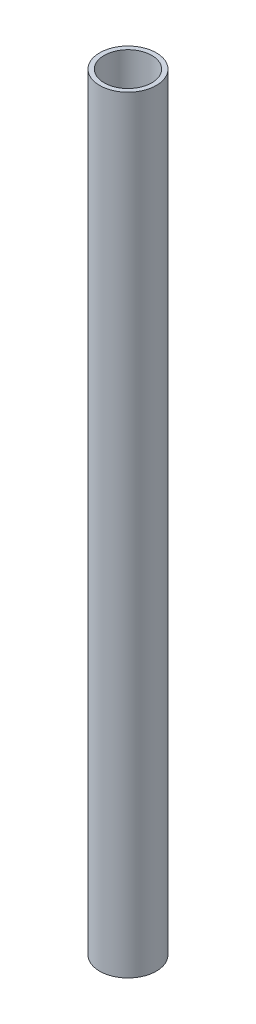
ISO-10303-21;
HEADER;
FILE_DESCRIPTION(('STEP AP214'),'2;1');
FILE_NAME('part.step','',(''),(''),'','','');
FILE_SCHEMA(('AUTOMOTIVE_DESIGN { 1 0 10303 214 1 1 1 1 }'));
ENDSEC;
DATA;
#1=APPLICATION_CONTEXT('core data for automotive mechanical design processes');
#2=APPLICATION_PROTOCOL_DEFINITION('international standard','automotive_design',2000,#1);
#3=PRODUCT_CONTEXT('',#1,'mechanical');
#4=PRODUCT('Part','Part','',(#3));
#5=PRODUCT_RELATED_PRODUCT_CATEGORY('part','',(#4));
#6=PRODUCT_DEFINITION_FORMATION('','',#4);
#7=PRODUCT_DEFINITION_CONTEXT('part definition',#1,'design');
#8=PRODUCT_DEFINITION('design','',#6,#7);
#9=PRODUCT_DEFINITION_SHAPE('','',#8);
#10=(LENGTH_UNIT() NAMED_UNIT(*) SI_UNIT(.MILLI.,.METRE.));
#11=(NAMED_UNIT(*) PLANE_ANGLE_UNIT() SI_UNIT($,.RADIAN.));
#12=(NAMED_UNIT(*) SI_UNIT($,.STERADIAN.) SOLID_ANGLE_UNIT());
#13=UNCERTAINTY_MEASURE_WITH_UNIT(LENGTH_MEASURE(1.E-05),#10,'distance_accuracy_value','');
#14=(GEOMETRIC_REPRESENTATION_CONTEXT(3) GLOBAL_UNCERTAINTY_ASSIGNED_CONTEXT((#13)) GLOBAL_UNIT_ASSIGNED_CONTEXT((#10,
#11,#12)) REPRESENTATION_CONTEXT('',''));
#15=CARTESIAN_POINT('',(0.,0.,0.));
#16=DIRECTION('',(0.,0.,1.));
#17=DIRECTION('',(1.,0.,0.));
#18=AXIS2_PLACEMENT_3D('',#15,#16,#17);
#19=CARTESIAN_POINT('',(0.,14.5,0.));
#20=DIRECTION('',(0.,1.,0.));
#21=DIRECTION('',(0.,0.,1.));
#22=AXIS2_PLACEMENT_3D('',#19,#20,#21);
#23=PLANE('',#22);
#24=CARTESIAN_POINT('',(0.,14.5,0.));
#25=DIRECTION('',(0.,1.,0.));
#26=DIRECTION('',(0.,0.,1.));
#27=AXIS2_PLACEMENT_3D('',#24,#25,#26);
#28=CIRCLE('',#27,0.535);
#29=CARTESIAN_POINT('',(0.,14.5,0.535));
#30=VERTEX_POINT('',#29);
#31=EDGE_CURVE('E10',#30,#30,#28,.T.);
#32=ORIENTED_EDGE('',*,*,#31,.T.);
#33=EDGE_LOOP('',(#32));
#34=FACE_BOUND('',#33,.T.);
#35=CARTESIAN_POINT('',(0.,14.5,0.));
#36=DIRECTION('',(0.,1.,0.));
#37=DIRECTION('',(0.,0.,1.));
#38=AXIS2_PLACEMENT_3D('',#35,#36,#37);
#39=CIRCLE('',#38,0.45);
#40=CARTESIAN_POINT('',(0.,14.5,0.45));
#41=VERTEX_POINT('',#40);
#42=EDGE_CURVE('E42',#41,#41,#39,.T.);
#43=ORIENTED_EDGE('',*,*,#42,.F.);
#44=EDGE_LOOP('',(#43));
#45=FACE_BOUND('',#44,.T.);
#46=ADVANCED_FACE('F31',(#34,#45),#23,.T.);
#47=CARTESIAN_POINT('',(0.,0.,0.));
#48=DIRECTION('',(0.,1.,0.));
#49=DIRECTION('',(0.,0.,1.));
#50=AXIS2_PLACEMENT_3D('',#47,#48,#49);
#51=PLANE('',#50);
#52=CARTESIAN_POINT('',(0.,0.,0.));
#53=DIRECTION('',(0.,1.,0.));
#54=DIRECTION('',(0.,0.,1.));
#55=AXIS2_PLACEMENT_3D('',#52,#53,#54);
#56=CIRCLE('',#55,0.535);
#57=CARTESIAN_POINT('',(0.,0.,0.535));
#58=VERTEX_POINT('',#57);
#59=EDGE_CURVE('E35',#58,#58,#56,.T.);
#60=ORIENTED_EDGE('',*,*,#59,.F.);
#61=EDGE_LOOP('',(#60));
#62=FACE_BOUND('',#61,.T.);
#63=CARTESIAN_POINT('',(0.,0.,0.));
#64=DIRECTION('',(0.,1.,0.));
#65=DIRECTION('',(0.,0.,1.));
#66=AXIS2_PLACEMENT_3D('',#63,#64,#65);
#67=CIRCLE('',#66,0.45);
#68=CARTESIAN_POINT('',(0.,0.,0.45));
#69=VERTEX_POINT('',#68);
#70=EDGE_CURVE('E44',#69,#69,#67,.T.);
#71=ORIENTED_EDGE('',*,*,#70,.T.);
#72=EDGE_LOOP('',(#71));
#73=FACE_BOUND('',#72,.T.);
#74=ADVANCED_FACE('F54',(#62,#73),#51,.F.);
#75=CARTESIAN_POINT('',(0.,14.5,0.));
#76=DIRECTION('',(0.,-1.,0.));
#77=DIRECTION('',(0.,0.,-1.));
#78=AXIS2_PLACEMENT_3D('',#75,#76,#77);
#79=CYLINDRICAL_SURFACE('',#78,0.535);
#80=ORIENTED_EDGE('',*,*,#31,.F.);
#81=EDGE_LOOP('',(#80));
#82=FACE_BOUND('',#81,.T.);
#83=ORIENTED_EDGE('',*,*,#59,.T.);
#84=EDGE_LOOP('',(#83));
#85=FACE_BOUND('',#84,.T.);
#86=ADVANCED_FACE('F33',(#82,#85),#79,.T.);
#87=CARTESIAN_POINT('',(0.,14.5,0.));
#88=DIRECTION('',(0.,-1.,0.));
#89=DIRECTION('',(0.,0.,-1.));
#90=AXIS2_PLACEMENT_3D('',#87,#88,#89);
#91=CYLINDRICAL_SURFACE('',#90,0.45);
#92=ORIENTED_EDGE('',*,*,#42,.T.);
#93=EDGE_LOOP('',(#92));
#94=FACE_BOUND('',#93,.T.);
#95=ORIENTED_EDGE('',*,*,#70,.F.);
#96=EDGE_LOOP('',(#95));
#97=FACE_BOUND('',#96,.T.);
#98=ADVANCED_FACE('F50',(#94,#97),#91,.F.);
#99=CLOSED_SHELL('',(#46,#74,#86,#98));
#100=MANIFOLD_SOLID_BREP('B2',#99);
#101=ADVANCED_BREP_SHAPE_REPRESENTATION('',(#18,#100),#14);
#102=SHAPE_DEFINITION_REPRESENTATION(#9,#101);
ENDSEC;
END-ISO-10303-21;
